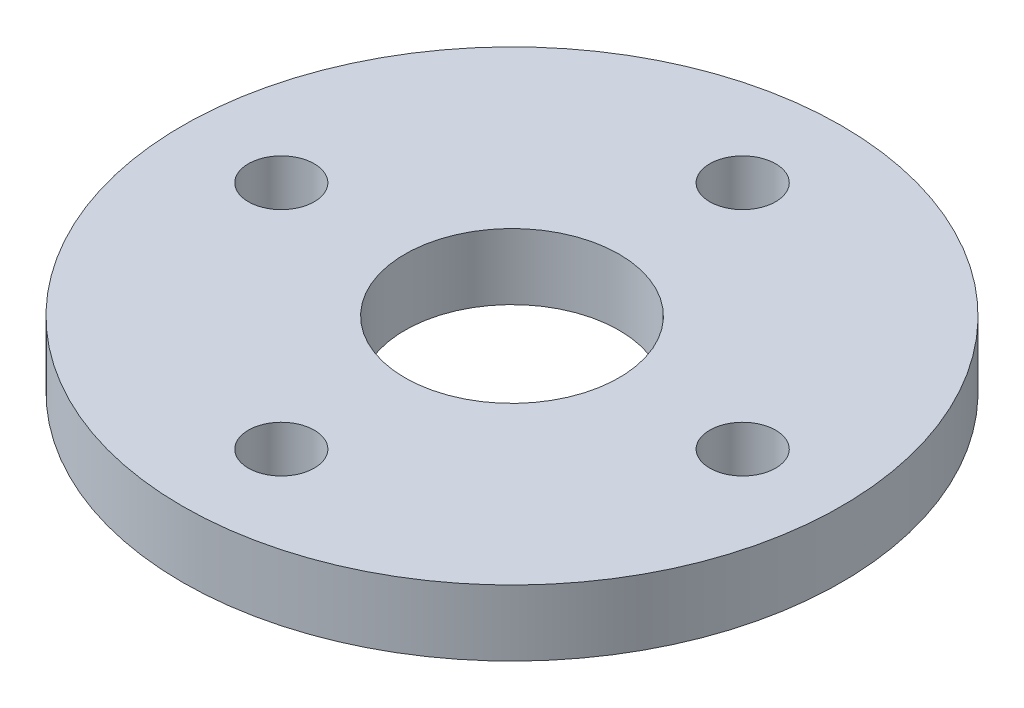
ISO-10303-21;
HEADER;
FILE_DESCRIPTION(('STEP AP214'),'2;1');
FILE_NAME('part.step','',(''),(''),'','','');
FILE_SCHEMA(('AUTOMOTIVE_DESIGN { 1 0 10303 214 1 1 1 1 }'));
ENDSEC;
DATA;
#1=APPLICATION_CONTEXT('core data for automotive mechanical design processes');
#2=APPLICATION_PROTOCOL_DEFINITION('international standard','automotive_design',2000,#1);
#3=PRODUCT_CONTEXT('',#1,'mechanical');
#4=PRODUCT('Part','Part','',(#3));
#5=PRODUCT_RELATED_PRODUCT_CATEGORY('part','',(#4));
#6=PRODUCT_DEFINITION_FORMATION('','',#4);
#7=PRODUCT_DEFINITION_CONTEXT('part definition',#1,'design');
#8=PRODUCT_DEFINITION('design','',#6,#7);
#9=PRODUCT_DEFINITION_SHAPE('','',#8);
#10=(LENGTH_UNIT() NAMED_UNIT(*) SI_UNIT(.MILLI.,.METRE.));
#11=(NAMED_UNIT(*) PLANE_ANGLE_UNIT() SI_UNIT($,.RADIAN.));
#12=(NAMED_UNIT(*) SI_UNIT($,.STERADIAN.) SOLID_ANGLE_UNIT());
#13=UNCERTAINTY_MEASURE_WITH_UNIT(LENGTH_MEASURE(1.E-05),#10,'distance_accuracy_value','');
#14=(GEOMETRIC_REPRESENTATION_CONTEXT(3) GLOBAL_UNCERTAINTY_ASSIGNED_CONTEXT((#13)) GLOBAL_UNIT_ASSIGNED_CONTEXT((#10,
#11,#12)) REPRESENTATION_CONTEXT('',''));
#15=CARTESIAN_POINT('',(0.,0.,0.));
#16=DIRECTION('',(0.,0.,1.));
#17=DIRECTION('',(1.,0.,0.));
#18=AXIS2_PLACEMENT_3D('',#15,#16,#17);
#19=CARTESIAN_POINT('',(0.,2.,0.));
#20=DIRECTION('',(0.,1.,0.));
#21=DIRECTION('',(0.,0.,1.));
#22=AXIS2_PLACEMENT_3D('',#19,#20,#21);
#23=PLANE('',#22);
#24=CARTESIAN_POINT('',(0.,2.,7.));
#25=DIRECTION('',(0.,1.,0.));
#26=DIRECTION('',(0.,0.,1.));
#27=AXIS2_PLACEMENT_3D('',#24,#25,#26);
#28=CIRCLE('',#27,1.);
#29=CARTESIAN_POINT('',(0.,2.,8.));
#30=VERTEX_POINT('',#29);
#31=EDGE_CURVE('E65',#30,#30,#28,.T.);
#32=ORIENTED_EDGE('',*,*,#31,.F.);
#33=EDGE_LOOP('',(#32));
#34=FACE_BOUND('',#33,.T.);
#35=CARTESIAN_POINT('',(0.,2.,-7.));
#36=DIRECTION('',(0.,1.,0.));
#37=DIRECTION('',(0.,0.,1.));
#38=AXIS2_PLACEMENT_3D('',#35,#36,#37);
#39=CIRCLE('',#38,1.);
#40=CARTESIAN_POINT('',(0.,2.,-6.));
#41=VERTEX_POINT('',#40);
#42=EDGE_CURVE('E53',#41,#41,#39,.T.);
#43=ORIENTED_EDGE('',*,*,#42,.F.);
#44=EDGE_LOOP('',(#43));
#45=FACE_BOUND('',#44,.T.);
#46=CARTESIAN_POINT('',(0.,2.,0.));
#47=DIRECTION('',(0.,1.,0.));
#48=DIRECTION('',(0.,0.,1.));
#49=AXIS2_PLACEMENT_3D('',#46,#47,#48);
#50=CIRCLE('',#49,10.);
#51=CARTESIAN_POINT('',(0.,2.,10.));
#52=VERTEX_POINT('',#51);
#53=EDGE_CURVE('E10',#52,#52,#50,.T.);
#54=ORIENTED_EDGE('',*,*,#53,.T.);
#55=EDGE_LOOP('',(#54));
#56=FACE_BOUND('',#55,.T.);
#57=CARTESIAN_POINT('',(0.,2.,0.));
#58=DIRECTION('',(0.,1.,0.));
#59=DIRECTION('',(0.,0.,1.));
#60=AXIS2_PLACEMENT_3D('',#57,#58,#59);
#61=CIRCLE('',#60,3.25);
#62=CARTESIAN_POINT('',(0.,2.,3.25));
#63=VERTEX_POINT('',#62);
#64=EDGE_CURVE('E48',#63,#63,#61,.T.);
#65=ORIENTED_EDGE('',*,*,#64,.F.);
#66=EDGE_LOOP('',(#65));
#67=FACE_BOUND('',#66,.T.);
#68=CARTESIAN_POINT('',(7.,2.,0.));
#69=DIRECTION('',(0.,1.,0.));
#70=DIRECTION('',(0.,0.,1.));
#71=AXIS2_PLACEMENT_3D('',#68,#69,#70);
#72=CIRCLE('',#71,1.);
#73=CARTESIAN_POINT('',(7.,2.,1.00000000000002));
#74=VERTEX_POINT('',#73);
#75=EDGE_CURVE('E59',#74,#74,#72,.T.);
#76=ORIENTED_EDGE('',*,*,#75,.F.);
#77=EDGE_LOOP('',(#76));
#78=FACE_BOUND('',#77,.T.);
#79=CARTESIAN_POINT('',(-7.,2.,0.));
#80=DIRECTION('',(0.,1.,0.));
#81=DIRECTION('',(0.,0.,1.));
#82=AXIS2_PLACEMENT_3D('',#79,#80,#81);
#83=CIRCLE('',#82,1.);
#84=CARTESIAN_POINT('',(-7.,2.,0.999999999999927));
#85=VERTEX_POINT('',#84);
#86=EDGE_CURVE('E71',#85,#85,#83,.T.);
#87=ORIENTED_EDGE('',*,*,#86,.F.);
#88=EDGE_LOOP('',(#87));
#89=FACE_BOUND('',#88,.T.);
#90=ADVANCED_FACE('F37',(#34,#45,#56,#67,#78,#89),#23,.T.);
#91=CARTESIAN_POINT('',(0.,0.,0.));
#92=DIRECTION('',(0.,1.,0.));
#93=DIRECTION('',(0.,0.,1.));
#94=AXIS2_PLACEMENT_3D('',#91,#92,#93);
#95=PLANE('',#94);
#96=CARTESIAN_POINT('',(0.,0.,0.));
#97=DIRECTION('',(0.,1.,0.));
#98=DIRECTION('',(0.,0.,1.));
#99=AXIS2_PLACEMENT_3D('',#96,#97,#98);
#100=CIRCLE('',#99,10.);
#101=CARTESIAN_POINT('',(0.,0.,10.));
#102=VERTEX_POINT('',#101);
#103=EDGE_CURVE('E41',#102,#102,#100,.T.);
#104=ORIENTED_EDGE('',*,*,#103,.F.);
#105=EDGE_LOOP('',(#104));
#106=FACE_BOUND('',#105,.T.);
#107=CARTESIAN_POINT('',(0.,0.,0.));
#108=DIRECTION('',(0.,1.,0.));
#109=DIRECTION('',(0.,0.,1.));
#110=AXIS2_PLACEMENT_3D('',#107,#108,#109);
#111=CIRCLE('',#110,3.25);
#112=CARTESIAN_POINT('',(0.,0.,3.25));
#113=VERTEX_POINT('',#112);
#114=EDGE_CURVE('E50',#113,#113,#111,.T.);
#115=ORIENTED_EDGE('',*,*,#114,.T.);
#116=EDGE_LOOP('',(#115));
#117=FACE_BOUND('',#116,.T.);
#118=CARTESIAN_POINT('',(0.,0.,-7.));
#119=DIRECTION('',(0.,1.,0.));
#120=DIRECTION('',(0.,0.,1.));
#121=AXIS2_PLACEMENT_3D('',#118,#119,#120);
#122=CIRCLE('',#121,1.);
#123=CARTESIAN_POINT('',(0.,0.,-6.));
#124=VERTEX_POINT('',#123);
#125=EDGE_CURVE('E56',#124,#124,#122,.T.);
#126=ORIENTED_EDGE('',*,*,#125,.T.);
#127=EDGE_LOOP('',(#126));
#128=FACE_BOUND('',#127,.T.);
#129=CARTESIAN_POINT('',(7.,0.,0.));
#130=DIRECTION('',(0.,1.,0.));
#131=DIRECTION('',(0.,0.,1.));
#132=AXIS2_PLACEMENT_3D('',#129,#130,#131);
#133=CIRCLE('',#132,1.);
#134=CARTESIAN_POINT('',(7.,0.,1.00000000000002));
#135=VERTEX_POINT('',#134);
#136=EDGE_CURVE('E62',#135,#135,#133,.T.);
#137=ORIENTED_EDGE('',*,*,#136,.T.);
#138=EDGE_LOOP('',(#137));
#139=FACE_BOUND('',#138,.T.);
#140=CARTESIAN_POINT('',(0.,0.,7.));
#141=DIRECTION('',(0.,1.,0.));
#142=DIRECTION('',(0.,0.,1.));
#143=AXIS2_PLACEMENT_3D('',#140,#141,#142);
#144=CIRCLE('',#143,1.);
#145=CARTESIAN_POINT('',(0.,0.,8.));
#146=VERTEX_POINT('',#145);
#147=EDGE_CURVE('E68',#146,#146,#144,.T.);
#148=ORIENTED_EDGE('',*,*,#147,.T.);
#149=EDGE_LOOP('',(#148));
#150=FACE_BOUND('',#149,.T.);
#151=CARTESIAN_POINT('',(-7.,0.,0.));
#152=DIRECTION('',(0.,1.,0.));
#153=DIRECTION('',(0.,0.,1.));
#154=AXIS2_PLACEMENT_3D('',#151,#152,#153);
#155=CIRCLE('',#154,1.);
#156=CARTESIAN_POINT('',(-7.,0.,0.999999999999927));
#157=VERTEX_POINT('',#156);
#158=EDGE_CURVE('E74',#157,#157,#155,.T.);
#159=ORIENTED_EDGE('',*,*,#158,.T.);
#160=EDGE_LOOP('',(#159));
#161=FACE_BOUND('',#160,.T.);
#162=ADVANCED_FACE('F84',(#106,#117,#128,#139,#150,#161),#95,.F.);
#163=CARTESIAN_POINT('',(0.,2.,0.));
#164=DIRECTION('',(0.,-1.,0.));
#165=DIRECTION('',(0.,0.,-1.));
#166=AXIS2_PLACEMENT_3D('',#163,#164,#165);
#167=CYLINDRICAL_SURFACE('',#166,10.);
#168=ORIENTED_EDGE('',*,*,#53,.F.);
#169=EDGE_LOOP('',(#168));
#170=FACE_BOUND('',#169,.T.);
#171=ORIENTED_EDGE('',*,*,#103,.T.);
#172=EDGE_LOOP('',(#171));
#173=FACE_BOUND('',#172,.T.);
#174=ADVANCED_FACE('F39',(#170,#173),#167,.T.);
#175=CARTESIAN_POINT('',(0.,2.,0.));
#176=DIRECTION('',(0.,-1.,0.));
#177=DIRECTION('',(0.,0.,-1.));
#178=AXIS2_PLACEMENT_3D('',#175,#176,#177);
#179=CYLINDRICAL_SURFACE('',#178,3.25);
#180=ORIENTED_EDGE('',*,*,#64,.T.);
#181=EDGE_LOOP('',(#180));
#182=FACE_BOUND('',#181,.T.);
#183=ORIENTED_EDGE('',*,*,#114,.F.);
#184=EDGE_LOOP('',(#183));
#185=FACE_BOUND('',#184,.T.);
#186=ADVANCED_FACE('F94',(#182,#185),#179,.F.);
#187=CARTESIAN_POINT('',(0.,2.,-7.));
#188=DIRECTION('',(0.,-1.,0.));
#189=DIRECTION('',(0.,0.,-1.));
#190=AXIS2_PLACEMENT_3D('',#187,#188,#189);
#191=CYLINDRICAL_SURFACE('',#190,1.);
#192=ORIENTED_EDGE('',*,*,#42,.T.);
#193=EDGE_LOOP('',(#192));
#194=FACE_BOUND('',#193,.T.);
#195=ORIENTED_EDGE('',*,*,#125,.F.);
#196=EDGE_LOOP('',(#195));
#197=FACE_BOUND('',#196,.T.);
#198=ADVANCED_FACE('F97',(#194,#197),#191,.F.);
#199=CARTESIAN_POINT('',(7.,2.,0.));
#200=DIRECTION('',(0.,-1.,0.));
#201=DIRECTION('',(0.,0.,-1.));
#202=AXIS2_PLACEMENT_3D('',#199,#200,#201);
#203=CYLINDRICAL_SURFACE('',#202,1.);
#204=ORIENTED_EDGE('',*,*,#75,.T.);
#205=EDGE_LOOP('',(#204));
#206=FACE_BOUND('',#205,.T.);
#207=ORIENTED_EDGE('',*,*,#136,.F.);
#208=EDGE_LOOP('',(#207));
#209=FACE_BOUND('',#208,.T.);
#210=ADVANCED_FACE('F101',(#206,#209),#203,.F.);
#211=CARTESIAN_POINT('',(0.,2.,7.));
#212=DIRECTION('',(0.,-1.,0.));
#213=DIRECTION('',(0.,0.,-1.));
#214=AXIS2_PLACEMENT_3D('',#211,#212,#213);
#215=CYLINDRICAL_SURFACE('',#214,1.);
#216=ORIENTED_EDGE('',*,*,#31,.T.);
#217=EDGE_LOOP('',(#216));
#218=FACE_BOUND('',#217,.T.);
#219=ORIENTED_EDGE('',*,*,#147,.F.);
#220=EDGE_LOOP('',(#219));
#221=FACE_BOUND('',#220,.T.);
#222=ADVANCED_FACE('F105',(#218,#221),#215,.F.);
#223=CARTESIAN_POINT('',(-7.,2.,0.));
#224=DIRECTION('',(0.,-1.,0.));
#225=DIRECTION('',(0.,0.,-1.));
#226=AXIS2_PLACEMENT_3D('',#223,#224,#225);
#227=CYLINDRICAL_SURFACE('',#226,1.);
#228=ORIENTED_EDGE('',*,*,#86,.T.);
#229=EDGE_LOOP('',(#228));
#230=FACE_BOUND('',#229,.T.);
#231=ORIENTED_EDGE('',*,*,#158,.F.);
#232=EDGE_LOOP('',(#231));
#233=FACE_BOUND('',#232,.T.);
#234=ADVANCED_FACE('F80',(#230,#233),#227,.F.);
#235=CLOSED_SHELL('',(#90,#162,#174,#186,#198,#210,#222,#234));
#236=MANIFOLD_SOLID_BREP('B2',#235);
#237=ADVANCED_BREP_SHAPE_REPRESENTATION('',(#18,#236),#14);
#238=SHAPE_DEFINITION_REPRESENTATION(#9,#237);
ENDSEC;
END-ISO-10303-21;
